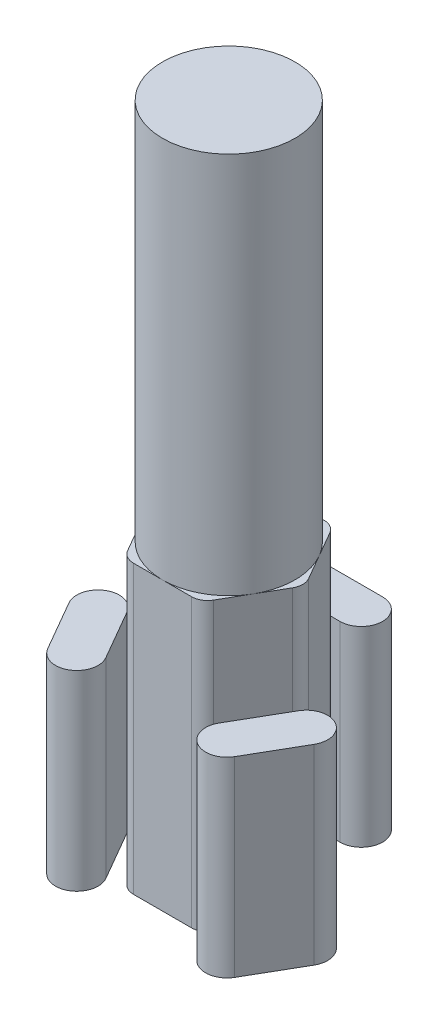
ISO-10303-21;
HEADER;
FILE_DESCRIPTION(('STEP AP214'),'2;1');
FILE_NAME('part.step','',(''),(''),'','','');
FILE_SCHEMA(('AUTOMOTIVE_DESIGN { 1 0 10303 214 1 1 1 1 }'));
ENDSEC;
DATA;
#1=APPLICATION_CONTEXT('core data for automotive mechanical design processes');
#2=APPLICATION_PROTOCOL_DEFINITION('international standard','automotive_design',2000,#1);
#3=PRODUCT_CONTEXT('',#1,'mechanical');
#4=PRODUCT('Part','Part','',(#3));
#5=PRODUCT_RELATED_PRODUCT_CATEGORY('part','',(#4));
#6=PRODUCT_DEFINITION_FORMATION('','',#4);
#7=PRODUCT_DEFINITION_CONTEXT('part definition',#1,'design');
#8=PRODUCT_DEFINITION('design','',#6,#7);
#9=PRODUCT_DEFINITION_SHAPE('','',#8);
#10=(LENGTH_UNIT() NAMED_UNIT(*) SI_UNIT(.MILLI.,.METRE.));
#11=(NAMED_UNIT(*) PLANE_ANGLE_UNIT() SI_UNIT($,.RADIAN.));
#12=(NAMED_UNIT(*) SI_UNIT($,.STERADIAN.) SOLID_ANGLE_UNIT());
#13=UNCERTAINTY_MEASURE_WITH_UNIT(LENGTH_MEASURE(1.E-05),#10,'distance_accuracy_value','');
#14=(GEOMETRIC_REPRESENTATION_CONTEXT(3) GLOBAL_UNCERTAINTY_ASSIGNED_CONTEXT((#13)) GLOBAL_UNIT_ASSIGNED_CONTEXT((#10,
#11,#12)) REPRESENTATION_CONTEXT('',''));
#15=CARTESIAN_POINT('',(0.,0.,0.));
#16=DIRECTION('',(0.,0.,1.));
#17=DIRECTION('',(1.,0.,0.));
#18=AXIS2_PLACEMENT_3D('',#15,#16,#17);
#19=CARTESIAN_POINT('',(-0.23558088659788,0.9,0.241243419565394));
#20=DIRECTION('',(0.,-1.,0.));
#21=DIRECTION('',(0.,0.,-1.));
#22=AXIS2_PLACEMENT_3D('',#19,#20,#21);
#23=CYLINDRICAL_SURFACE('',#22,0.066794645314256);
#24=DIRECTION('',(0.,-1.,0.));
#25=VECTOR('',#24,1.);
#26=CARTESIAN_POINT('',(-0.177735026918963,0.9,0.207846096908266));
#27=LINE('',#26,#25);
#28=CARTESIAN_POINT('',(-0.177735026918963,0.6,0.207846096908266));
#29=VERTEX_POINT('',#28);
#30=CARTESIAN_POINT('',(-0.177735026918963,0.,0.207846096908266));
#31=VERTEX_POINT('',#30);
#32=EDGE_CURVE('E12',#29,#31,#27,.T.);
#33=ORIENTED_EDGE('',*,*,#32,.F.);
#34=CARTESIAN_POINT('',(-0.23558088659788,0.6,0.241243419565394));
#35=DIRECTION('',(0.,1.,0.));
#36=DIRECTION('',(0.,0.,-1.));
#37=AXIS2_PLACEMENT_3D('',#34,#35,#36);
#38=CIRCLE('',#37,0.066794645314256);
#39=CARTESIAN_POINT('',(-0.293426746276797,0.6,0.274640742222522));
#40=VERTEX_POINT('',#39);
#41=EDGE_CURVE('E86',#40,#29,#38,.T.);
#42=ORIENTED_EDGE('',*,*,#41,.F.);
#43=DIRECTION('',(0.,-1.,0.));
#44=VECTOR('',#43,1.);
#45=CARTESIAN_POINT('',(-0.293426746276797,0.9,0.274640742222522));
#46=LINE('',#45,#44);
#47=CARTESIAN_POINT('',(-0.293426746276797,0.,0.274640742222522));
#48=VERTEX_POINT('',#47);
#49=EDGE_CURVE('E70',#40,#48,#46,.T.);
#50=ORIENTED_EDGE('',*,*,#49,.T.);
#51=CARTESIAN_POINT('',(-0.23558088659788,0.,0.241243419565394));
#52=DIRECTION('',(0.,1.,0.));
#53=DIRECTION('',(0.,0.,-1.));
#54=AXIS2_PLACEMENT_3D('',#51,#52,#53);
#55=CIRCLE('',#54,0.066794645314256);
#56=EDGE_CURVE('E100',#48,#31,#55,.T.);
#57=ORIENTED_EDGE('',*,*,#56,.T.);
#58=EDGE_LOOP('',(#33,#42,#50,#57));
#59=FACE_BOUND('',#58,.T.);
#60=ADVANCED_FACE('F48',(#59),#23,.T.);
#61=CARTESIAN_POINT('',(-0.268867513459482,0.9,0.0500000000000002));
#62=DIRECTION('',(-0.866025403784438,0.,0.500000000000001));
#63=DIRECTION('',(0.500000000000001,0.,0.866025403784438));
#64=AXIS2_PLACEMENT_3D('',#61,#62,#63);
#65=PLANE('',#64);
#66=DIRECTION('',(0.,-1.,0.));
#67=VECTOR('',#66,1.);
#68=CARTESIAN_POINT('',(-0.268867513459482,0.9,0.0500000000000002));
#69=LINE('',#68,#67);
#70=CARTESIAN_POINT('',(-0.268867513459482,0.6,0.0500000000000002));
#71=VERTEX_POINT('',#70);
#72=CARTESIAN_POINT('',(-0.268867513459482,0.,0.0500000000000002));
#73=VERTEX_POINT('',#72);
#74=EDGE_CURVE('E55',#71,#73,#69,.T.);
#75=ORIENTED_EDGE('',*,*,#74,.F.);
#76=DIRECTION('',(-0.500000000000001,0.,-0.866025403784438));
#77=VECTOR('',#76,1.);
#78=CARTESIAN_POINT('',(-0.177735026918963,0.6,0.207846096908266));
#79=LINE('',#78,#77);
#80=EDGE_CURVE('E89',#29,#71,#79,.T.);
#81=ORIENTED_EDGE('',*,*,#80,.F.);
#82=ORIENTED_EDGE('',*,*,#32,.T.);
#83=DIRECTION('',(-0.500000000000001,0.,-0.866025403784438));
#84=VECTOR('',#83,1.);
#85=CARTESIAN_POINT('',(-0.268867513459482,0.,0.0500000000000002));
#86=LINE('',#85,#84);
#87=EDGE_CURVE('E103',#31,#73,#86,.T.);
#88=ORIENTED_EDGE('',*,*,#87,.T.);
#89=EDGE_LOOP('',(#75,#81,#82,#88));
#90=FACE_BOUND('',#89,.T.);
#91=ADVANCED_FACE('F95',(#90),#65,.F.);
#92=CARTESIAN_POINT('',(-0.326713373138399,0.9,0.0833973226571282));
#93=DIRECTION('',(0.,-1.,0.));
#94=DIRECTION('',(0.,0.,-1.));
#95=AXIS2_PLACEMENT_3D('',#92,#93,#94);
#96=CYLINDRICAL_SURFACE('',#95,0.066794645314256);
#97=DIRECTION('',(0.,-1.,0.));
#98=VECTOR('',#97,1.);
#99=CARTESIAN_POINT('',(-0.384559232817316,0.9,0.116794645314256));
#100=LINE('',#99,#98);
#101=CARTESIAN_POINT('',(-0.384559232817316,0.6,0.116794645314256));
#102=VERTEX_POINT('',#101);
#103=CARTESIAN_POINT('',(-0.384559232817316,0.,0.116794645314256));
#104=VERTEX_POINT('',#103);
#105=EDGE_CURVE('E115',#102,#104,#100,.T.);
#106=ORIENTED_EDGE('',*,*,#105,.F.);
#107=CARTESIAN_POINT('',(-0.326713373138399,0.6,0.0833973226571282));
#108=DIRECTION('',(0.,1.,0.));
#109=DIRECTION('',(0.,0.,-1.));
#110=AXIS2_PLACEMENT_3D('',#107,#108,#109);
#111=CIRCLE('',#110,0.0667946453142561);
#112=EDGE_CURVE('E62',#71,#102,#111,.T.);
#113=ORIENTED_EDGE('',*,*,#112,.F.);
#114=ORIENTED_EDGE('',*,*,#74,.T.);
#115=CARTESIAN_POINT('',(-0.326713373138399,0.,0.0833973226571282));
#116=DIRECTION('',(0.,1.,0.));
#117=DIRECTION('',(0.,0.,1.));
#118=AXIS2_PLACEMENT_3D('',#115,#116,#117);
#119=CIRCLE('',#118,0.066794645314256);
#120=EDGE_CURVE('E105',#73,#104,#119,.T.);
#121=ORIENTED_EDGE('',*,*,#120,.T.);
#122=EDGE_LOOP('',(#106,#113,#114,#121));
#123=FACE_BOUND('',#122,.T.);
#124=ADVANCED_FACE('F118',(#123),#96,.T.);
#125=CARTESIAN_POINT('',(-0.384559232817316,0.9,0.116794645314256));
#126=DIRECTION('',(0.866025403784438,0.,-0.500000000000001));
#127=DIRECTION('',(-0.500000000000001,0.,-0.866025403784438));
#128=AXIS2_PLACEMENT_3D('',#125,#126,#127);
#129=PLANE('',#128);
#130=ORIENTED_EDGE('',*,*,#49,.F.);
#131=DIRECTION('',(0.500000000000001,0.,0.866025403784438));
#132=VECTOR('',#131,1.);
#133=CARTESIAN_POINT('',(-0.293426746276797,0.6,0.274640742222522));
#134=LINE('',#133,#132);
#135=EDGE_CURVE('E90',#102,#40,#134,.T.);
#136=ORIENTED_EDGE('',*,*,#135,.F.);
#137=ORIENTED_EDGE('',*,*,#105,.T.);
#138=DIRECTION('',(0.500000000000001,0.,0.866025403784438));
#139=VECTOR('',#138,1.);
#140=CARTESIAN_POINT('',(-0.384559232817316,0.,0.116794645314256));
#141=LINE('',#140,#139);
#142=EDGE_CURVE('E112',#104,#48,#141,.T.);
#143=ORIENTED_EDGE('',*,*,#142,.T.);
#144=EDGE_LOOP('',(#130,#136,#137,#143));
#145=FACE_BOUND('',#144,.T.);
#146=ADVANCED_FACE('F122',(#145),#129,.F.);
#147=CARTESIAN_POINT('',(-0.23558088659788,0.,0.241243419565394));
#148=DIRECTION('',(0.,-1.,0.));
#149=DIRECTION('',(0.,0.,-1.));
#150=AXIS2_PLACEMENT_3D('',#147,#148,#149);
#151=PLANE('',#150);
#152=ORIENTED_EDGE('',*,*,#56,.F.);
#153=ORIENTED_EDGE('',*,*,#142,.F.);
#154=ORIENTED_EDGE('',*,*,#120,.F.);
#155=ORIENTED_EDGE('',*,*,#87,.F.);
#156=EDGE_LOOP('',(#152,#153,#154,#155));
#157=FACE_BOUND('',#156,.T.);
#158=ADVANCED_FACE('F120',(#157),#151,.T.);
#159=CARTESIAN_POINT('',(-0.23558088659788,0.6,0.241243419565394));
#160=DIRECTION('',(0.,-1.,0.));
#161=DIRECTION('',(0.,0.,-1.));
#162=AXIS2_PLACEMENT_3D('',#159,#160,#161);
#163=PLANE('',#162);
#164=ORIENTED_EDGE('',*,*,#41,.T.);
#165=ORIENTED_EDGE('',*,*,#80,.T.);
#166=ORIENTED_EDGE('',*,*,#112,.T.);
#167=ORIENTED_EDGE('',*,*,#135,.T.);
#168=EDGE_LOOP('',(#164,#165,#166,#167));
#169=FACE_BOUND('',#168,.T.);
#170=ADVANCED_FACE('F88',(#169),#163,.F.);
#171=CLOSED_SHELL('',(#60,#91,#124,#146,#158,#170));
#172=MANIFOLD_SOLID_BREP('B2',#171);
#173=CARTESIAN_POINT('',(0.326713373138399,0.9,0.083397322657128));
#174=DIRECTION('',(0.,-1.,0.));
#175=DIRECTION('',(0.,0.,-1.));
#176=AXIS2_PLACEMENT_3D('',#173,#174,#175);
#177=CYLINDRICAL_SURFACE('',#176,0.066794645314256);
#178=DIRECTION('',(0.,-1.,0.));
#179=VECTOR('',#178,1.);
#180=CARTESIAN_POINT('',(0.268867513459482,0.9,0.05));
#181=LINE('',#180,#179);
#182=CARTESIAN_POINT('',(0.268867513459482,0.6,0.05));
#183=VERTEX_POINT('',#182);
#184=CARTESIAN_POINT('',(0.268867513459482,0.,0.05));
#185=VERTEX_POINT('',#184);
#186=EDGE_CURVE('E46',#183,#185,#181,.T.);
#187=ORIENTED_EDGE('',*,*,#186,.F.);
#188=CARTESIAN_POINT('',(0.326713373138399,0.6,0.083397322657128));
#189=DIRECTION('',(0.,1.,0.));
#190=DIRECTION('',(0.,0.,-1.));
#191=AXIS2_PLACEMENT_3D('',#188,#189,#190);
#192=CIRCLE('',#191,0.066794645314256);
#193=CARTESIAN_POINT('',(0.384559232817316,0.6,0.116794645314256));
#194=VERTEX_POINT('',#193);
#195=EDGE_CURVE('E220',#194,#183,#192,.T.);
#196=ORIENTED_EDGE('',*,*,#195,.F.);
#197=DIRECTION('',(0.,-1.,0.));
#198=VECTOR('',#197,1.);
#199=CARTESIAN_POINT('',(0.384559232817316,0.9,0.116794645314256));
#200=LINE('',#199,#198);
#201=CARTESIAN_POINT('',(0.384559232817316,0.,0.116794645314256));
#202=VERTEX_POINT('',#201);
#203=EDGE_CURVE('E204',#194,#202,#200,.T.);
#204=ORIENTED_EDGE('',*,*,#203,.T.);
#205=CARTESIAN_POINT('',(0.326713373138399,0.,0.083397322657128));
#206=DIRECTION('',(0.,1.,0.));
#207=DIRECTION('',(0.,0.,-1.));
#208=AXIS2_PLACEMENT_3D('',#205,#206,#207);
#209=CIRCLE('',#208,0.066794645314256);
#210=EDGE_CURVE('E234',#202,#185,#209,.T.);
#211=ORIENTED_EDGE('',*,*,#210,.T.);
#212=EDGE_LOOP('',(#187,#196,#204,#211));
#213=FACE_BOUND('',#212,.T.);
#214=ADVANCED_FACE('F182',(#213),#177,.T.);
#215=CARTESIAN_POINT('',(0.177735026918963,0.9,0.207846096908266));
#216=DIRECTION('',(0.866025403784439,0.,0.5));
#217=DIRECTION('',(0.5,0.,-0.866025403784439));
#218=AXIS2_PLACEMENT_3D('',#215,#216,#217);
#219=PLANE('',#218);
#220=DIRECTION('',(0.,-1.,0.));
#221=VECTOR('',#220,1.);
#222=CARTESIAN_POINT('',(0.177735026918963,0.9,0.207846096908266));
#223=LINE('',#222,#221);
#224=CARTESIAN_POINT('',(0.177735026918963,0.6,0.207846096908266));
#225=VERTEX_POINT('',#224);
#226=CARTESIAN_POINT('',(0.177735026918963,0.,0.207846096908266));
#227=VERTEX_POINT('',#226);
#228=EDGE_CURVE('E189',#225,#227,#223,.T.);
#229=ORIENTED_EDGE('',*,*,#228,.F.);
#230=DIRECTION('',(-0.5,0.,0.866025403784439));
#231=VECTOR('',#230,1.);
#232=CARTESIAN_POINT('',(0.268867513459482,0.6,0.05));
#233=LINE('',#232,#231);
#234=EDGE_CURVE('E223',#183,#225,#233,.T.);
#235=ORIENTED_EDGE('',*,*,#234,.F.);
#236=ORIENTED_EDGE('',*,*,#186,.T.);
#237=DIRECTION('',(-0.5,0.,0.866025403784439));
#238=VECTOR('',#237,1.);
#239=CARTESIAN_POINT('',(0.177735026918963,0.,0.207846096908266));
#240=LINE('',#239,#238);
#241=EDGE_CURVE('E237',#185,#227,#240,.T.);
#242=ORIENTED_EDGE('',*,*,#241,.T.);
#243=EDGE_LOOP('',(#229,#235,#236,#242));
#244=FACE_BOUND('',#243,.T.);
#245=ADVANCED_FACE('F229',(#244),#219,.F.);
#246=CARTESIAN_POINT('',(0.23558088659788,0.9,0.241243419565394));
#247=DIRECTION('',(0.,-1.,0.));
#248=DIRECTION('',(0.,0.,-1.));
#249=AXIS2_PLACEMENT_3D('',#246,#247,#248);
#250=CYLINDRICAL_SURFACE('',#249,0.066794645314256);
#251=DIRECTION('',(0.,-1.,0.));
#252=VECTOR('',#251,1.);
#253=CARTESIAN_POINT('',(0.293426746276797,0.9,0.274640742222522));
#254=LINE('',#253,#252);
#255=CARTESIAN_POINT('',(0.293426746276797,0.6,0.274640742222522));
#256=VERTEX_POINT('',#255);
#257=CARTESIAN_POINT('',(0.293426746276797,0.,0.274640742222522));
#258=VERTEX_POINT('',#257);
#259=EDGE_CURVE('E249',#256,#258,#254,.T.);
#260=ORIENTED_EDGE('',*,*,#259,.F.);
#261=CARTESIAN_POINT('',(0.23558088659788,0.6,0.241243419565394));
#262=DIRECTION('',(0.,1.,0.));
#263=DIRECTION('',(0.,0.,-1.));
#264=AXIS2_PLACEMENT_3D('',#261,#262,#263);
#265=CIRCLE('',#264,0.066794645314256);
#266=EDGE_CURVE('E196',#225,#256,#265,.T.);
#267=ORIENTED_EDGE('',*,*,#266,.F.);
#268=ORIENTED_EDGE('',*,*,#228,.T.);
#269=CARTESIAN_POINT('',(0.23558088659788,0.,0.241243419565394));
#270=DIRECTION('',(0.,1.,0.));
#271=DIRECTION('',(0.,0.,1.));
#272=AXIS2_PLACEMENT_3D('',#269,#270,#271);
#273=CIRCLE('',#272,0.066794645314256);
#274=EDGE_CURVE('E239',#227,#258,#273,.T.);
#275=ORIENTED_EDGE('',*,*,#274,.T.);
#276=EDGE_LOOP('',(#260,#267,#268,#275));
#277=FACE_BOUND('',#276,.T.);
#278=ADVANCED_FACE('F252',(#277),#250,.T.);
#279=CARTESIAN_POINT('',(0.293426746276797,0.9,0.274640742222522));
#280=DIRECTION('',(-0.866025403784439,0.,-0.5));
#281=DIRECTION('',(-0.5,0.,0.866025403784439));
#282=AXIS2_PLACEMENT_3D('',#279,#280,#281);
#283=PLANE('',#282);
#284=ORIENTED_EDGE('',*,*,#203,.F.);
#285=DIRECTION('',(0.5,0.,-0.866025403784439));
#286=VECTOR('',#285,1.);
#287=CARTESIAN_POINT('',(0.384559232817316,0.6,0.116794645314256));
#288=LINE('',#287,#286);
#289=EDGE_CURVE('E224',#256,#194,#288,.T.);
#290=ORIENTED_EDGE('',*,*,#289,.F.);
#291=ORIENTED_EDGE('',*,*,#259,.T.);
#292=DIRECTION('',(0.5,0.,-0.866025403784439));
#293=VECTOR('',#292,1.);
#294=CARTESIAN_POINT('',(0.293426746276797,0.,0.274640742222522));
#295=LINE('',#294,#293);
#296=EDGE_CURVE('E246',#258,#202,#295,.T.);
#297=ORIENTED_EDGE('',*,*,#296,.T.);
#298=EDGE_LOOP('',(#284,#290,#291,#297));
#299=FACE_BOUND('',#298,.T.);
#300=ADVANCED_FACE('F256',(#299),#283,.F.);
#301=CARTESIAN_POINT('',(0.326713373138399,0.,0.083397322657128));
#302=DIRECTION('',(0.,-1.,0.));
#303=DIRECTION('',(0.,0.,-1.));
#304=AXIS2_PLACEMENT_3D('',#301,#302,#303);
#305=PLANE('',#304);
#306=ORIENTED_EDGE('',*,*,#210,.F.);
#307=ORIENTED_EDGE('',*,*,#296,.F.);
#308=ORIENTED_EDGE('',*,*,#274,.F.);
#309=ORIENTED_EDGE('',*,*,#241,.F.);
#310=EDGE_LOOP('',(#306,#307,#308,#309));
#311=FACE_BOUND('',#310,.T.);
#312=ADVANCED_FACE('F254',(#311),#305,.T.);
#313=CARTESIAN_POINT('',(0.326713373138399,0.6,0.083397322657128));
#314=DIRECTION('',(0.,-1.,0.));
#315=DIRECTION('',(0.,0.,-1.));
#316=AXIS2_PLACEMENT_3D('',#313,#314,#315);
#317=PLANE('',#316);
#318=ORIENTED_EDGE('',*,*,#195,.T.);
#319=ORIENTED_EDGE('',*,*,#234,.T.);
#320=ORIENTED_EDGE('',*,*,#266,.T.);
#321=ORIENTED_EDGE('',*,*,#289,.T.);
#322=EDGE_LOOP('',(#318,#319,#320,#321));
#323=FACE_BOUND('',#322,.T.);
#324=ADVANCED_FACE('F222',(#323),#317,.F.);
#325=CLOSED_SHELL('',(#214,#245,#278,#300,#312,#324));
#326=MANIFOLD_SOLID_BREP('B6',#325);
#327=CARTESIAN_POINT('',(-0.0911324865405191,0.9,-0.324640742222522));
#328=DIRECTION('',(0.,-1.,0.));
#329=DIRECTION('',(0.,0.,-1.));
#330=AXIS2_PLACEMENT_3D('',#327,#328,#329);
#331=CYLINDRICAL_SURFACE('',#330,0.066794645314256);
#332=CARTESIAN_POINT('',(-0.0911324865405192,0.6,-0.324640742222522));
#333=DIRECTION('',(0.,1.,0.));
#334=DIRECTION('',(0.,0.,1.));
#335=AXIS2_PLACEMENT_3D('',#332,#333,#334);
#336=CIRCLE('',#335,0.066794645314256);
#337=CARTESIAN_POINT('',(-0.0911324865405193,0.6,-0.391435387536778));
#338=VERTEX_POINT('',#337);
#339=CARTESIAN_POINT('',(-0.0911324865405191,0.6,-0.257846096908266));
#340=VERTEX_POINT('',#339);
#341=EDGE_CURVE('E353',#338,#340,#336,.T.);
#342=ORIENTED_EDGE('',*,*,#341,.F.);
#343=DIRECTION('',(0.,-1.,0.));
#344=VECTOR('',#343,1.);
#345=CARTESIAN_POINT('',(-0.0911324865405191,0.9,-0.391435387536778));
#346=LINE('',#345,#344);
#347=CARTESIAN_POINT('',(-0.0911324865405191,0.,-0.391435387536778));
#348=VERTEX_POINT('',#347);
#349=EDGE_CURVE('E337',#338,#348,#346,.T.);
#350=ORIENTED_EDGE('',*,*,#349,.T.);
#351=CARTESIAN_POINT('',(-0.0911324865405191,0.,-0.324640742222522));
#352=DIRECTION('',(0.,1.,0.));
#353=DIRECTION('',(0.,0.,-1.));
#354=AXIS2_PLACEMENT_3D('',#351,#352,#353);
#355=CIRCLE('',#354,0.066794645314256);
#356=CARTESIAN_POINT('',(-0.0911324865405191,0.,-0.257846096908266));
#357=VERTEX_POINT('',#356);
#358=EDGE_CURVE('E367',#348,#357,#355,.T.);
#359=ORIENTED_EDGE('',*,*,#358,.T.);
#360=DIRECTION('',(0.,-1.,0.));
#361=VECTOR('',#360,1.);
#362=CARTESIAN_POINT('',(-0.0911324865405191,0.9,-0.257846096908266));
#363=LINE('',#362,#361);
#364=EDGE_CURVE('E180',#340,#357,#363,.T.);
#365=ORIENTED_EDGE('',*,*,#364,.F.);
#366=EDGE_LOOP('',(#342,#350,#359,#365));
#367=FACE_BOUND('',#366,.T.);
#368=ADVANCED_FACE('F315',(#367),#331,.T.);
#369=CARTESIAN_POINT('',(-0.0911324865405191,0.9,-0.257846096908266));
#370=DIRECTION('',(0.,0.,-1.));
#371=DIRECTION('',(-1.,0.,0.));
#372=AXIS2_PLACEMENT_3D('',#369,#370,#371);
#373=PLANE('',#372);
#374=DIRECTION('',(1.,0.,0.));
#375=VECTOR('',#374,1.);
#376=CARTESIAN_POINT('',(0.0911324865405191,0.6,-0.257846096908266));
#377=LINE('',#376,#375);
#378=CARTESIAN_POINT('',(0.0911324865405191,0.6,-0.257846096908266));
#379=VERTEX_POINT('',#378);
#380=EDGE_CURVE('E356',#340,#379,#377,.T.);
#381=ORIENTED_EDGE('',*,*,#380,.F.);
#382=ORIENTED_EDGE('',*,*,#364,.T.);
#383=DIRECTION('',(1.,0.,0.));
#384=VECTOR('',#383,1.);
#385=CARTESIAN_POINT('',(-0.0911324865405191,0.,-0.257846096908266));
#386=LINE('',#385,#384);
#387=CARTESIAN_POINT('',(0.0911324865405191,0.,-0.257846096908266));
#388=VERTEX_POINT('',#387);
#389=EDGE_CURVE('E370',#357,#388,#386,.T.);
#390=ORIENTED_EDGE('',*,*,#389,.T.);
#391=DIRECTION('',(0.,-1.,0.));
#392=VECTOR('',#391,1.);
#393=CARTESIAN_POINT('',(0.0911324865405191,0.9,-0.257846096908266));
#394=LINE('',#393,#392);
#395=EDGE_CURVE('E322',#379,#388,#394,.T.);
#396=ORIENTED_EDGE('',*,*,#395,.F.);
#397=EDGE_LOOP('',(#381,#382,#390,#396));
#398=FACE_BOUND('',#397,.T.);
#399=ADVANCED_FACE('F362',(#398),#373,.F.);
#400=CARTESIAN_POINT('',(0.0911324865405191,0.9,-0.324640742222522));
#401=DIRECTION('',(0.,-1.,0.));
#402=DIRECTION('',(0.,0.,-1.));
#403=AXIS2_PLACEMENT_3D('',#400,#401,#402);
#404=CYLINDRICAL_SURFACE('',#403,0.066794645314256);
#405=CARTESIAN_POINT('',(0.0911324865405189,0.6,-0.324640742222522));
#406=DIRECTION('',(0.,1.,0.));
#407=DIRECTION('',(0.,0.,1.));
#408=AXIS2_PLACEMENT_3D('',#405,#406,#407);
#409=CIRCLE('',#408,0.066794645314256);
#410=CARTESIAN_POINT('',(0.0911324865405191,0.6,-0.391435387536778));
#411=VERTEX_POINT('',#410);
#412=EDGE_CURVE('E329',#379,#411,#409,.T.);
#413=ORIENTED_EDGE('',*,*,#412,.F.);
#414=ORIENTED_EDGE('',*,*,#395,.T.);
#415=CARTESIAN_POINT('',(0.0911324865405191,0.,-0.324640742222522));
#416=DIRECTION('',(0.,1.,0.));
#417=DIRECTION('',(0.,0.,1.));
#418=AXIS2_PLACEMENT_3D('',#415,#416,#417);
#419=CIRCLE('',#418,0.066794645314256);
#420=CARTESIAN_POINT('',(0.0911324865405191,0.,-0.391435387536778));
#421=VERTEX_POINT('',#420);
#422=EDGE_CURVE('E372',#388,#421,#419,.T.);
#423=ORIENTED_EDGE('',*,*,#422,.T.);
#424=DIRECTION('',(0.,-1.,0.));
#425=VECTOR('',#424,1.);
#426=CARTESIAN_POINT('',(0.0911324865405191,0.9,-0.391435387536778));
#427=LINE('',#426,#425);
#428=EDGE_CURVE('E382',#411,#421,#427,.T.);
#429=ORIENTED_EDGE('',*,*,#428,.F.);
#430=EDGE_LOOP('',(#413,#414,#423,#429));
#431=FACE_BOUND('',#430,.T.);
#432=ADVANCED_FACE('F384',(#431),#404,.T.);
#433=CARTESIAN_POINT('',(-0.0911324865405191,0.9,-0.391435387536778));
#434=DIRECTION('',(0.,0.,1.));
#435=DIRECTION('',(1.,0.,0.));
#436=AXIS2_PLACEMENT_3D('',#433,#434,#435);
#437=PLANE('',#436);
#438=DIRECTION('',(-1.,0.,0.));
#439=VECTOR('',#438,1.);
#440=CARTESIAN_POINT('',(-0.0911324865405193,0.6,-0.391435387536778));
#441=LINE('',#440,#439);
#442=EDGE_CURVE('E357',#411,#338,#441,.T.);
#443=ORIENTED_EDGE('',*,*,#442,.F.);
#444=ORIENTED_EDGE('',*,*,#428,.T.);
#445=DIRECTION('',(-1.,0.,0.));
#446=VECTOR('',#445,1.);
#447=CARTESIAN_POINT('',(-0.0911324865405191,0.,-0.391435387536778));
#448=LINE('',#447,#446);
#449=EDGE_CURVE('E379',#421,#348,#448,.T.);
#450=ORIENTED_EDGE('',*,*,#449,.T.);
#451=ORIENTED_EDGE('',*,*,#349,.F.);
#452=EDGE_LOOP('',(#443,#444,#450,#451));
#453=FACE_BOUND('',#452,.T.);
#454=ADVANCED_FACE('F389',(#453),#437,.F.);
#455=CARTESIAN_POINT('',(-0.0911324865405191,0.,-0.324640742222522));
#456=DIRECTION('',(0.,-1.,0.));
#457=DIRECTION('',(0.,0.,-1.));
#458=AXIS2_PLACEMENT_3D('',#455,#456,#457);
#459=PLANE('',#458);
#460=ORIENTED_EDGE('',*,*,#358,.F.);
#461=ORIENTED_EDGE('',*,*,#449,.F.);
#462=ORIENTED_EDGE('',*,*,#422,.F.);
#463=ORIENTED_EDGE('',*,*,#389,.F.);
#464=EDGE_LOOP('',(#460,#461,#462,#463));
#465=FACE_BOUND('',#464,.T.);
#466=ADVANCED_FACE('F387',(#465),#459,.T.);
#467=CARTESIAN_POINT('',(-0.0911324865405192,0.6,-0.324640742222522));
#468=DIRECTION('',(0.,1.,0.));
#469=DIRECTION('',(0.,0.,1.));
#470=AXIS2_PLACEMENT_3D('',#467,#468,#469);
#471=PLANE('',#470);
#472=ORIENTED_EDGE('',*,*,#341,.T.);
#473=ORIENTED_EDGE('',*,*,#380,.T.);
#474=ORIENTED_EDGE('',*,*,#412,.T.);
#475=ORIENTED_EDGE('',*,*,#442,.T.);
#476=EDGE_LOOP('',(#472,#473,#474,#475));
#477=FACE_BOUND('',#476,.T.);
#478=ADVANCED_FACE('F355',(#477),#471,.T.);
#479=CLOSED_SHELL('',(#368,#399,#432,#454,#466,#478));
#480=MANIFOLD_SOLID_BREP('B40',#479);
#481=CARTESIAN_POINT('',(-0.0911324865405191,0.9,-0.157846096908266));
#482=DIRECTION('',(0.,-1.,0.));
#483=DIRECTION('',(0.,0.,-1.));
#484=AXIS2_PLACEMENT_3D('',#481,#482,#483);
#485=PLANE('',#484);
#486=CARTESIAN_POINT('',(0.,0.9,0.));
#487=DIRECTION('',(0.,1.,0.));
#488=DIRECTION('',(0.,0.,1.));
#489=AXIS2_PLACEMENT_3D('',#486,#487,#488);
#490=CIRCLE('',#489,0.207846096908266);
#491=CARTESIAN_POINT('',(0.,0.9,0.207846096908266));
#492=VERTEX_POINT('',#491);
#493=CARTESIAN_POINT('',(0.180000000000001,0.9,0.103923048454133));
#494=VERTEX_POINT('',#493);
#495=EDGE_CURVE('E450',#492,#494,#490,.T.);
#496=ORIENTED_EDGE('',*,*,#495,.F.);
#497=DIRECTION('',(1.,0.,0.));
#498=VECTOR('',#497,1.);
#499=CARTESIAN_POINT('',(-0.091132486540519,0.9,0.207846096908266));
#500=LINE('',#499,#498);
#501=CARTESIAN_POINT('',(0.0911324865405191,0.9,0.207846096908266));
#502=VERTEX_POINT('',#501);
#503=EDGE_CURVE('E561',#492,#502,#500,.T.);
#504=ORIENTED_EDGE('',*,*,#503,.T.);
#505=CARTESIAN_POINT('',(0.0911324865405191,0.9,0.157846096908266));
#506=DIRECTION('',(0.,1.,0.));
#507=DIRECTION('',(0.,0.,1.));
#508=AXIS2_PLACEMENT_3D('',#505,#506,#507);
#509=CIRCLE('',#508,0.05);
#510=CARTESIAN_POINT('',(0.134433756729741,0.9,0.182846096908266));
#511=VERTEX_POINT('',#510);
#512=EDGE_CURVE('E560',#502,#511,#509,.T.);
#513=ORIENTED_EDGE('',*,*,#512,.T.);
#514=DIRECTION('',(0.5,0.,-0.866025403784438));
#515=VECTOR('',#514,1.);
#516=CARTESIAN_POINT('',(0.134433756729741,0.9,0.182846096908266));
#517=LINE('',#516,#515);
#518=EDGE_CURVE('E573',#511,#494,#517,.T.);
#519=ORIENTED_EDGE('',*,*,#518,.T.);
#520=EDGE_LOOP('',(#496,#504,#513,#519));
#521=FACE_BOUND('',#520,.T.);
#522=ADVANCED_FACE('F439',(#521),#485,.F.);
#523=CARTESIAN_POINT('',(0.180000000000001,0.9,-0.103923048454133));
#524=VERTEX_POINT('',#523);
#525=EDGE_CURVE('E313',#494,#524,#490,.T.);
#526=ORIENTED_EDGE('',*,*,#525,.F.);
#527=CARTESIAN_POINT('',(0.22556624327026,0.9,0.0250000000000001));
#528=VERTEX_POINT('',#527);
#529=EDGE_CURVE('E598',#494,#528,#517,.T.);
#530=ORIENTED_EDGE('',*,*,#529,.T.);
#531=CARTESIAN_POINT('',(0.182264973081038,0.9,0.));
#532=DIRECTION('',(0.,1.,0.));
#533=DIRECTION('',(0.,0.,1.));
#534=AXIS2_PLACEMENT_3D('',#531,#532,#533);
#535=CIRCLE('',#534,0.05);
#536=CARTESIAN_POINT('',(0.22556624327026,0.9,-0.0249999999999999));
#537=VERTEX_POINT('',#536);
#538=EDGE_CURVE('E600',#528,#537,#535,.T.);
#539=ORIENTED_EDGE('',*,*,#538,.T.);
#540=DIRECTION('',(-0.5,0.,-0.866025403784439));
#541=VECTOR('',#540,1.);
#542=CARTESIAN_POINT('',(0.22556624327026,0.9,-0.0249999999999999));
#543=LINE('',#542,#541);
#544=EDGE_CURVE('E603',#537,#524,#543,.T.);
#545=ORIENTED_EDGE('',*,*,#544,.T.);
#546=EDGE_LOOP('',(#526,#530,#539,#545));
#547=FACE_BOUND('',#546,.T.);
#548=ADVANCED_FACE('F694',(#547),#485,.F.);
#549=CARTESIAN_POINT('',(0.,0.9,-0.207846096908266));
#550=VERTEX_POINT('',#549);
#551=EDGE_CURVE('E448',#524,#550,#490,.T.);
#552=ORIENTED_EDGE('',*,*,#551,.F.);
#553=CARTESIAN_POINT('',(0.134433756729741,0.9,-0.182846096908266));
#554=VERTEX_POINT('',#553);
#555=EDGE_CURVE('E602',#524,#554,#543,.T.);
#556=ORIENTED_EDGE('',*,*,#555,.T.);
#557=CARTESIAN_POINT('',(0.0911324865405191,0.9,-0.157846096908266));
#558=DIRECTION('',(0.,1.,0.));
#559=DIRECTION('',(0.,0.,1.));
#560=AXIS2_PLACEMENT_3D('',#557,#558,#559);
#561=CIRCLE('',#560,0.05);
#562=CARTESIAN_POINT('',(0.0911324865405191,0.9,-0.207846096908266));
#563=VERTEX_POINT('',#562);
#564=EDGE_CURVE('E606',#554,#563,#561,.T.);
#565=ORIENTED_EDGE('',*,*,#564,.T.);
#566=DIRECTION('',(-1.,0.,0.));
#567=VECTOR('',#566,1.);
#568=CARTESIAN_POINT('',(0.0911324865405191,0.9,-0.207846096908266));
#569=LINE('',#568,#567);
#570=EDGE_CURVE('E609',#563,#550,#569,.T.);
#571=ORIENTED_EDGE('',*,*,#570,.T.);
#572=EDGE_LOOP('',(#552,#556,#565,#571));
#573=FACE_BOUND('',#572,.T.);
#574=ADVANCED_FACE('F702',(#573),#485,.F.);
#575=CARTESIAN_POINT('',(-0.18,0.9,-0.103923048454133));
#576=VERTEX_POINT('',#575);
#577=EDGE_CURVE('E457',#550,#576,#490,.T.);
#578=ORIENTED_EDGE('',*,*,#577,.F.);
#579=CARTESIAN_POINT('',(-0.0911324865405191,0.9,-0.207846096908266));
#580=VERTEX_POINT('',#579);
#581=EDGE_CURVE('E608',#550,#580,#569,.T.);
#582=ORIENTED_EDGE('',*,*,#581,.T.);
#583=CARTESIAN_POINT('',(-0.0911324865405191,0.9,-0.157846096908266));
#584=DIRECTION('',(0.,1.,0.));
#585=DIRECTION('',(0.,0.,-1.));
#586=AXIS2_PLACEMENT_3D('',#583,#584,#585);
#587=CIRCLE('',#586,0.05);
#588=CARTESIAN_POINT('',(-0.134433756729741,0.9,-0.182846096908266));
#589=VERTEX_POINT('',#588);
#590=EDGE_CURVE('E583',#580,#589,#587,.T.);
#591=ORIENTED_EDGE('',*,*,#590,.T.);
#592=DIRECTION('',(-0.5,0.,0.866025403784439));
#593=VECTOR('',#592,1.);
#594=CARTESIAN_POINT('',(-0.134433756729741,0.9,-0.182846096908266));
#595=LINE('',#594,#593);
#596=EDGE_CURVE('E588',#589,#576,#595,.T.);
#597=ORIENTED_EDGE('',*,*,#596,.T.);
#598=EDGE_LOOP('',(#578,#582,#591,#597));
#599=FACE_BOUND('',#598,.T.);
#600=ADVANCED_FACE('F713',(#599),#485,.F.);
#601=CARTESIAN_POINT('',(-0.180000000000001,0.9,0.103923048454133));
#602=VERTEX_POINT('',#601);
#603=EDGE_CURVE('E578',#576,#602,#490,.T.);
#604=ORIENTED_EDGE('',*,*,#603,.F.);
#605=CARTESIAN_POINT('',(-0.22556624327026,0.9,-0.025));
#606=VERTEX_POINT('',#605);
#607=EDGE_CURVE('E586',#576,#606,#595,.T.);
#608=ORIENTED_EDGE('',*,*,#607,.T.);
#609=CARTESIAN_POINT('',(-0.182264973081038,0.9,0.));
#610=DIRECTION('',(0.,1.,0.));
#611=DIRECTION('',(0.,0.,-1.));
#612=AXIS2_PLACEMENT_3D('',#609,#610,#611);
#613=CIRCLE('',#612,0.05);
#614=CARTESIAN_POINT('',(-0.22556624327026,0.9,0.025));
#615=VERTEX_POINT('',#614);
#616=EDGE_CURVE('E590',#606,#615,#613,.T.);
#617=ORIENTED_EDGE('',*,*,#616,.T.);
#618=DIRECTION('',(0.5,0.,0.866025403784439));
#619=VECTOR('',#618,1.);
#620=CARTESIAN_POINT('',(-0.22556624327026,0.9,0.025));
#621=LINE('',#620,#619);
#622=EDGE_CURVE('E593',#615,#602,#621,.T.);
#623=ORIENTED_EDGE('',*,*,#622,.T.);
#624=EDGE_LOOP('',(#604,#608,#617,#623));
#625=FACE_BOUND('',#624,.T.);
#626=ADVANCED_FACE('F718',(#625),#485,.F.);
#627=CARTESIAN_POINT('',(-0.0911324865405191,0.9,-0.157846096908266));
#628=DIRECTION('',(0.,-1.,0.));
#629=DIRECTION('',(0.,0.,-1.));
#630=AXIS2_PLACEMENT_3D('',#627,#628,#629);
#631=CYLINDRICAL_SURFACE('',#630,0.05);
#632=CARTESIAN_POINT('',(-0.0911324865405191,0.,-0.157846096908266));
#633=DIRECTION('',(0.,1.,0.));
#634=DIRECTION('',(0.,0.,-1.));
#635=AXIS2_PLACEMENT_3D('',#632,#633,#634);
#636=CIRCLE('',#635,0.05);
#637=CARTESIAN_POINT('',(-0.0911324865405191,0.,-0.207846096908266));
#638=VERTEX_POINT('',#637);
#639=CARTESIAN_POINT('',(-0.134433756729741,0.,-0.182846096908266));
#640=VERTEX_POINT('',#639);
#641=EDGE_CURVE('E612',#638,#640,#636,.T.);
#642=ORIENTED_EDGE('',*,*,#641,.T.);
#643=DIRECTION('',(0.,-1.,0.));
#644=VECTOR('',#643,1.);
#645=CARTESIAN_POINT('',(-0.134433756729741,0.9,-0.182846096908266));
#646=LINE('',#645,#644);
#647=EDGE_CURVE('E443',#589,#640,#646,.T.);
#648=ORIENTED_EDGE('',*,*,#647,.F.);
#649=ORIENTED_EDGE('',*,*,#590,.F.);
#650=DIRECTION('',(0.,-1.,0.));
#651=VECTOR('',#650,1.);
#652=CARTESIAN_POINT('',(-0.0911324865405191,0.9,-0.207846096908266));
#653=LINE('',#652,#651);
#654=EDGE_CURVE('E611',#580,#638,#653,.T.);
#655=ORIENTED_EDGE('',*,*,#654,.T.);
#656=EDGE_LOOP('',(#642,#648,#649,#655));
#657=FACE_BOUND('',#656,.T.);
#658=ADVANCED_FACE('F441',(#657),#631,.T.);
#659=CARTESIAN_POINT('',(-0.134433756729741,0.9,-0.182846096908266));
#660=DIRECTION('',(0.866025403784439,0.,0.5));
#661=DIRECTION('',(0.5,0.,-0.866025403784439));
#662=AXIS2_PLACEMENT_3D('',#659,#660,#661);
#663=PLANE('',#662);
#664=DIRECTION('',(-0.5,0.,0.866025403784439));
#665=VECTOR('',#664,1.);
#666=CARTESIAN_POINT('',(-0.134433756729741,0.,-0.182846096908266));
#667=LINE('',#666,#665);
#668=CARTESIAN_POINT('',(-0.22556624327026,0.,-0.025));
#669=VERTEX_POINT('',#668);
#670=EDGE_CURVE('E615',#640,#669,#667,.T.);
#671=ORIENTED_EDGE('',*,*,#670,.T.);
#672=DIRECTION('',(0.,-1.,0.));
#673=VECTOR('',#672,1.);
#674=CARTESIAN_POINT('',(-0.22556624327026,0.9,-0.025));
#675=LINE('',#674,#673);
#676=EDGE_CURVE('E580',#606,#669,#675,.T.);
#677=ORIENTED_EDGE('',*,*,#676,.F.);
#678=ORIENTED_EDGE('',*,*,#607,.F.);
#679=ORIENTED_EDGE('',*,*,#596,.F.);
#680=ORIENTED_EDGE('',*,*,#647,.T.);
#681=EDGE_LOOP('',(#671,#677,#678,#679,#680));
#682=FACE_BOUND('',#681,.T.);
#683=ADVANCED_FACE('F716',(#682),#663,.F.);
#684=CARTESIAN_POINT('',(-0.182264973081038,0.9,0.));
#685=DIRECTION('',(0.,-1.,0.));
#686=DIRECTION('',(0.,0.,-1.));
#687=AXIS2_PLACEMENT_3D('',#684,#685,#686);
#688=CYLINDRICAL_SURFACE('',#687,0.05);
#689=CARTESIAN_POINT('',(-0.182264973081038,0.,0.));
#690=DIRECTION('',(0.,1.,0.));
#691=DIRECTION('',(0.,0.,-1.));
#692=AXIS2_PLACEMENT_3D('',#689,#690,#691);
#693=CIRCLE('',#692,0.05);
#694=CARTESIAN_POINT('',(-0.22556624327026,0.,0.025));
#695=VERTEX_POINT('',#694);
#696=EDGE_CURVE('E617',#669,#695,#693,.T.);
#697=ORIENTED_EDGE('',*,*,#696,.T.);
#698=DIRECTION('',(0.,-1.,0.));
#699=VECTOR('',#698,1.);
#700=CARTESIAN_POINT('',(-0.22556624327026,0.9,0.025));
#701=LINE('',#700,#699);
#702=EDGE_CURVE('E659',#615,#695,#701,.T.);
#703=ORIENTED_EDGE('',*,*,#702,.F.);
#704=ORIENTED_EDGE('',*,*,#616,.F.);
#705=ORIENTED_EDGE('',*,*,#676,.T.);
#706=EDGE_LOOP('',(#697,#703,#704,#705));
#707=FACE_BOUND('',#706,.T.);
#708=ADVANCED_FACE('F666',(#707),#688,.T.);
#709=CARTESIAN_POINT('',(-0.22556624327026,0.9,0.025));
#710=DIRECTION('',(0.866025403784439,0.,-0.5));
#711=DIRECTION('',(-0.5,0.,-0.866025403784439));
#712=AXIS2_PLACEMENT_3D('',#709,#710,#711);
#713=PLANE('',#712);
#714=DIRECTION('',(0.5,0.,0.866025403784439));
#715=VECTOR('',#714,1.);
#716=CARTESIAN_POINT('',(-0.22556624327026,0.,0.025));
#717=LINE('',#716,#715);
#718=CARTESIAN_POINT('',(-0.134433756729741,0.,0.182846096908266));
#719=VERTEX_POINT('',#718);
#720=EDGE_CURVE('E619',#695,#719,#717,.T.);
#721=ORIENTED_EDGE('',*,*,#720,.T.);
#722=DIRECTION('',(0.,-1.,0.));
#723=VECTOR('',#722,1.);
#724=CARTESIAN_POINT('',(-0.134433756729741,0.9,0.182846096908266));
#725=LINE('',#724,#723);
#726=CARTESIAN_POINT('',(-0.134433756729741,0.9,0.182846096908266));
#727=VERTEX_POINT('',#726);
#728=EDGE_CURVE('E656',#727,#719,#725,.T.);
#729=ORIENTED_EDGE('',*,*,#728,.F.);
#730=EDGE_CURVE('E592',#602,#727,#621,.T.);
#731=ORIENTED_EDGE('',*,*,#730,.F.);
#732=ORIENTED_EDGE('',*,*,#622,.F.);
#733=ORIENTED_EDGE('',*,*,#702,.T.);
#734=EDGE_LOOP('',(#721,#729,#731,#732,#733));
#735=FACE_BOUND('',#734,.T.);
#736=ADVANCED_FACE('F678',(#735),#713,.F.);
#737=CARTESIAN_POINT('',(-0.091132486540519,0.9,0.157846096908266));
#738=DIRECTION('',(0.,-1.,0.));
#739=DIRECTION('',(0.,0.,-1.));
#740=AXIS2_PLACEMENT_3D('',#737,#738,#739);
#741=CYLINDRICAL_SURFACE('',#740,0.05);
#742=CARTESIAN_POINT('',(-0.091132486540519,0.,0.157846096908266));
#743=DIRECTION('',(0.,1.,0.));
#744=DIRECTION('',(0.,0.,1.));
#745=AXIS2_PLACEMENT_3D('',#742,#743,#744);
#746=CIRCLE('',#745,0.05);
#747=CARTESIAN_POINT('',(-0.091132486540519,0.,0.207846096908266));
#748=VERTEX_POINT('',#747);
#749=EDGE_CURVE('E621',#719,#748,#746,.T.);
#750=ORIENTED_EDGE('',*,*,#749,.T.);
#751=DIRECTION('',(0.,-1.,0.));
#752=VECTOR('',#751,1.);
#753=CARTESIAN_POINT('',(-0.091132486540519,0.9,0.207846096908266));
#754=LINE('',#753,#752);
#755=CARTESIAN_POINT('',(-0.091132486540519,0.9,0.207846096908266));
#756=VERTEX_POINT('',#755);
#757=EDGE_CURVE('E654',#756,#748,#754,.T.);
#758=ORIENTED_EDGE('',*,*,#757,.F.);
#759=CARTESIAN_POINT('',(-0.091132486540519,0.9,0.157846096908266));
#760=DIRECTION('',(0.,1.,0.));
#761=DIRECTION('',(0.,0.,1.));
#762=AXIS2_PLACEMENT_3D('',#759,#760,#761);
#763=CIRCLE('',#762,0.05);
#764=EDGE_CURVE('E556',#727,#756,#763,.T.);
#765=ORIENTED_EDGE('',*,*,#764,.F.);
#766=ORIENTED_EDGE('',*,*,#728,.T.);
#767=EDGE_LOOP('',(#750,#758,#765,#766));
#768=FACE_BOUND('',#767,.T.);
#769=ADVANCED_FACE('F681',(#768),#741,.T.);
#770=CARTESIAN_POINT('',(-0.091132486540519,0.9,0.207846096908266));
#771=DIRECTION('',(0.,0.,-1.));
#772=DIRECTION('',(-1.,0.,0.));
#773=AXIS2_PLACEMENT_3D('',#770,#771,#772);
#774=PLANE('',#773);
#775=DIRECTION('',(1.,0.,0.));
#776=VECTOR('',#775,1.);
#777=CARTESIAN_POINT('',(-0.091132486540519,0.,0.207846096908266));
#778=LINE('',#777,#776);
#779=CARTESIAN_POINT('',(0.0911324865405191,0.,0.207846096908266));
#780=VERTEX_POINT('',#779);
#781=EDGE_CURVE('E623',#748,#780,#778,.T.);
#782=ORIENTED_EDGE('',*,*,#781,.T.);
#783=DIRECTION('',(0.,-1.,0.));
#784=VECTOR('',#783,1.);
#785=CARTESIAN_POINT('',(0.0911324865405191,0.9,0.207846096908266));
#786=LINE('',#785,#784);
#787=EDGE_CURVE('E567',#502,#780,#786,.T.);
#788=ORIENTED_EDGE('',*,*,#787,.F.);
#789=ORIENTED_EDGE('',*,*,#503,.F.);
#790=EDGE_CURVE('E549',#756,#492,#500,.T.);
#791=ORIENTED_EDGE('',*,*,#790,.F.);
#792=ORIENTED_EDGE('',*,*,#757,.T.);
#793=EDGE_LOOP('',(#782,#788,#789,#791,#792));
#794=FACE_BOUND('',#793,.T.);
#795=ADVANCED_FACE('F565',(#794),#774,.F.);
#796=CARTESIAN_POINT('',(0.0911324865405191,0.9,0.157846096908266));
#797=DIRECTION('',(0.,-1.,0.));
#798=DIRECTION('',(0.,0.,-1.));
#799=AXIS2_PLACEMENT_3D('',#796,#797,#798);
#800=CYLINDRICAL_SURFACE('',#799,0.05);
#801=CARTESIAN_POINT('',(0.0911324865405191,0.,0.157846096908266));
#802=DIRECTION('',(0.,1.,0.));
#803=DIRECTION('',(0.,0.,1.));
#804=AXIS2_PLACEMENT_3D('',#801,#802,#803);
#805=CIRCLE('',#804,0.05);
#806=CARTESIAN_POINT('',(0.134433756729741,0.,0.182846096908266));
#807=VERTEX_POINT('',#806);
#808=EDGE_CURVE('E625',#780,#807,#805,.T.);
#809=ORIENTED_EDGE('',*,*,#808,.T.);
#810=DIRECTION('',(0.,-1.,0.));
#811=VECTOR('',#810,1.);
#812=CARTESIAN_POINT('',(0.134433756729741,0.9,0.182846096908266));
#813=LINE('',#812,#811);
#814=EDGE_CURVE('E650',#511,#807,#813,.T.);
#815=ORIENTED_EDGE('',*,*,#814,.F.);
#816=ORIENTED_EDGE('',*,*,#512,.F.);
#817=ORIENTED_EDGE('',*,*,#787,.T.);
#818=EDGE_LOOP('',(#809,#815,#816,#817));
#819=FACE_BOUND('',#818,.T.);
#820=ADVANCED_FACE('F687',(#819),#800,.T.);
#821=CARTESIAN_POINT('',(0.134433756729741,0.9,0.182846096908266));
#822=DIRECTION('',(-0.866025403784438,0.,-0.5));
#823=DIRECTION('',(-0.5,0.,0.866025403784439));
#824=AXIS2_PLACEMENT_3D('',#821,#822,#823);
#825=PLANE('',#824);
#826=DIRECTION('',(0.5,0.,-0.866025403784438));
#827=VECTOR('',#826,1.);
#828=CARTESIAN_POINT('',(0.134433756729741,0.,0.182846096908266));
#829=LINE('',#828,#827);
#830=CARTESIAN_POINT('',(0.22556624327026,0.,0.0250000000000001));
#831=VERTEX_POINT('',#830);
#832=EDGE_CURVE('E627',#807,#831,#829,.T.);
#833=ORIENTED_EDGE('',*,*,#832,.T.);
#834=DIRECTION('',(0.,-1.,0.));
#835=VECTOR('',#834,1.);
#836=CARTESIAN_POINT('',(0.22556624327026,0.9,0.0250000000000001));
#837=LINE('',#836,#835);
#838=EDGE_CURVE('E647',#528,#831,#837,.T.);
#839=ORIENTED_EDGE('',*,*,#838,.F.);
#840=ORIENTED_EDGE('',*,*,#529,.F.);
#841=ORIENTED_EDGE('',*,*,#518,.F.);
#842=ORIENTED_EDGE('',*,*,#814,.T.);
#843=EDGE_LOOP('',(#833,#839,#840,#841,#842));
#844=FACE_BOUND('',#843,.T.);
#845=ADVANCED_FACE('F689',(#844),#825,.F.);
#846=CARTESIAN_POINT('',(0.182264973081038,0.9,0.));
#847=DIRECTION('',(0.,-1.,0.));
#848=DIRECTION('',(0.,0.,-1.));
#849=AXIS2_PLACEMENT_3D('',#846,#847,#848);
#850=CYLINDRICAL_SURFACE('',#849,0.05);
#851=CARTESIAN_POINT('',(0.182264973081038,0.,0.));
#852=DIRECTION('',(0.,1.,0.));
#853=DIRECTION('',(0.,0.,1.));
#854=AXIS2_PLACEMENT_3D('',#851,#852,#853);
#855=CIRCLE('',#854,0.05);
#856=CARTESIAN_POINT('',(0.22556624327026,0.,-0.0249999999999999));
#857=VERTEX_POINT('',#856);
#858=EDGE_CURVE('E629',#831,#857,#855,.T.);
#859=ORIENTED_EDGE('',*,*,#858,.T.);
#860=DIRECTION('',(0.,-1.,0.));
#861=VECTOR('',#860,1.);
#862=CARTESIAN_POINT('',(0.22556624327026,0.9,-0.0249999999999999));
#863=LINE('',#862,#861);
#864=EDGE_CURVE('E644',#537,#857,#863,.T.);
#865=ORIENTED_EDGE('',*,*,#864,.F.);
#866=ORIENTED_EDGE('',*,*,#538,.F.);
#867=ORIENTED_EDGE('',*,*,#838,.T.);
#868=EDGE_LOOP('',(#859,#865,#866,#867));
#869=FACE_BOUND('',#868,.T.);
#870=ADVANCED_FACE('F785',(#869),#850,.T.);
#871=CARTESIAN_POINT('',(0.22556624327026,0.9,-0.0249999999999999));
#872=DIRECTION('',(-0.866025403784439,0.,0.5));
#873=DIRECTION('',(0.5,0.,0.866025403784439));
#874=AXIS2_PLACEMENT_3D('',#871,#872,#873);
#875=PLANE('',#874);
#876=DIRECTION('',(-0.5,0.,-0.866025403784439));
#877=VECTOR('',#876,1.);
#878=CARTESIAN_POINT('',(0.22556624327026,0.,-0.0249999999999999));
#879=LINE('',#878,#877);
#880=CARTESIAN_POINT('',(0.134433756729741,0.,-0.182846096908266));
#881=VERTEX_POINT('',#880);
#882=EDGE_CURVE('E631',#857,#881,#879,.T.);
#883=ORIENTED_EDGE('',*,*,#882,.T.);
#884=DIRECTION('',(0.,-1.,0.));
#885=VECTOR('',#884,1.);
#886=CARTESIAN_POINT('',(0.134433756729741,0.9,-0.182846096908266));
#887=LINE('',#886,#885);
#888=EDGE_CURVE('E641',#554,#881,#887,.T.);
#889=ORIENTED_EDGE('',*,*,#888,.F.);
#890=ORIENTED_EDGE('',*,*,#555,.F.);
#891=ORIENTED_EDGE('',*,*,#544,.F.);
#892=ORIENTED_EDGE('',*,*,#864,.T.);
#893=EDGE_LOOP('',(#883,#889,#890,#891,#892));
#894=FACE_BOUND('',#893,.T.);
#895=ADVANCED_FACE('F698',(#894),#875,.F.);
#896=CARTESIAN_POINT('',(0.0911324865405191,0.9,-0.157846096908266));
#897=DIRECTION('',(0.,-1.,0.));
#898=DIRECTION('',(0.,0.,-1.));
#899=AXIS2_PLACEMENT_3D('',#896,#897,#898);
#900=CYLINDRICAL_SURFACE('',#899,0.05);
#901=CARTESIAN_POINT('',(0.0911324865405191,0.,-0.157846096908266));
#902=DIRECTION('',(0.,1.,0.));
#903=DIRECTION('',(0.,0.,1.));
#904=AXIS2_PLACEMENT_3D('',#901,#902,#903);
#905=CIRCLE('',#904,0.05);
#906=CARTESIAN_POINT('',(0.0911324865405191,0.,-0.207846096908266));
#907=VERTEX_POINT('',#906);
#908=EDGE_CURVE('E633',#881,#907,#905,.T.);
#909=ORIENTED_EDGE('',*,*,#908,.T.);
#910=DIRECTION('',(0.,-1.,0.));
#911=VECTOR('',#910,1.);
#912=CARTESIAN_POINT('',(0.0911324865405191,0.9,-0.207846096908266));
#913=LINE('',#912,#911);
#914=EDGE_CURVE('E638',#563,#907,#913,.T.);
#915=ORIENTED_EDGE('',*,*,#914,.F.);
#916=ORIENTED_EDGE('',*,*,#564,.F.);
#917=ORIENTED_EDGE('',*,*,#888,.T.);
#918=EDGE_LOOP('',(#909,#915,#916,#917));
#919=FACE_BOUND('',#918,.T.);
#920=ADVANCED_FACE('F706',(#919),#900,.T.);
#921=CARTESIAN_POINT('',(0.0911324865405191,0.9,-0.207846096908266));
#922=DIRECTION('',(0.,0.,1.));
#923=DIRECTION('',(1.,0.,0.));
#924=AXIS2_PLACEMENT_3D('',#921,#922,#923);
#925=PLANE('',#924);
#926=DIRECTION('',(-1.,0.,0.));
#927=VECTOR('',#926,1.);
#928=CARTESIAN_POINT('',(0.0911324865405191,0.,-0.207846096908266));
#929=LINE('',#928,#927);
#930=EDGE_CURVE('E587',#907,#638,#929,.T.);
#931=ORIENTED_EDGE('',*,*,#930,.T.);
#932=ORIENTED_EDGE('',*,*,#654,.F.);
#933=ORIENTED_EDGE('',*,*,#581,.F.);
#934=ORIENTED_EDGE('',*,*,#570,.F.);
#935=ORIENTED_EDGE('',*,*,#914,.T.);
#936=EDGE_LOOP('',(#931,#932,#933,#934,#935));
#937=FACE_BOUND('',#936,.T.);
#938=ADVANCED_FACE('F710',(#937),#925,.F.);
#939=EDGE_CURVE('E553',#602,#492,#490,.T.);
#940=ORIENTED_EDGE('',*,*,#939,.F.);
#941=ORIENTED_EDGE('',*,*,#730,.T.);
#942=ORIENTED_EDGE('',*,*,#764,.T.);
#943=ORIENTED_EDGE('',*,*,#790,.T.);
#944=EDGE_LOOP('',(#940,#941,#942,#943));
#945=FACE_BOUND('',#944,.T.);
#946=ADVANCED_FACE('F551',(#945),#485,.F.);
#947=CARTESIAN_POINT('',(-0.0911324865405191,0.,-0.157846096908266));
#948=DIRECTION('',(0.,-1.,0.));
#949=DIRECTION('',(0.,0.,-1.));
#950=AXIS2_PLACEMENT_3D('',#947,#948,#949);
#951=PLANE('',#950);
#952=ORIENTED_EDGE('',*,*,#641,.F.);
#953=ORIENTED_EDGE('',*,*,#930,.F.);
#954=ORIENTED_EDGE('',*,*,#908,.F.);
#955=ORIENTED_EDGE('',*,*,#882,.F.);
#956=ORIENTED_EDGE('',*,*,#858,.F.);
#957=ORIENTED_EDGE('',*,*,#832,.F.);
#958=ORIENTED_EDGE('',*,*,#808,.F.);
#959=ORIENTED_EDGE('',*,*,#781,.F.);
#960=ORIENTED_EDGE('',*,*,#749,.F.);
#961=ORIENTED_EDGE('',*,*,#720,.F.);
#962=ORIENTED_EDGE('',*,*,#696,.F.);
#963=ORIENTED_EDGE('',*,*,#670,.F.);
#964=EDGE_LOOP('',(#952,#953,#954,#955,#956,#957,#958,#959,#960,#961,#962,#963));
#965=FACE_BOUND('',#964,.T.);
#966=ADVANCED_FACE('F673',(#965),#951,.T.);
#967=CARTESIAN_POINT('',(0.,2.1,0.));
#968=DIRECTION('',(0.,-1.,0.));
#969=DIRECTION('',(0.,0.,-1.));
#970=AXIS2_PLACEMENT_3D('',#967,#968,#969);
#971=CYLINDRICAL_SURFACE('',#970,0.207846096908266);
#972=CARTESIAN_POINT('',(0.,2.1,0.));
#973=DIRECTION('',(0.,1.,0.));
#974=DIRECTION('',(0.,0.,1.));
#975=AXIS2_PLACEMENT_3D('',#972,#973,#974);
#976=CIRCLE('',#975,0.207846096908266);
#977=CARTESIAN_POINT('',(0.,2.1,0.207846096908266));
#978=VERTEX_POINT('',#977);
#979=EDGE_CURVE('E575',#978,#978,#976,.T.);
#980=ORIENTED_EDGE('',*,*,#979,.F.);
#981=EDGE_LOOP('',(#980));
#982=FACE_BOUND('',#981,.T.);
#983=ORIENTED_EDGE('',*,*,#495,.T.);
#984=ORIENTED_EDGE('',*,*,#525,.T.);
#985=ORIENTED_EDGE('',*,*,#551,.T.);
#986=ORIENTED_EDGE('',*,*,#577,.T.);
#987=ORIENTED_EDGE('',*,*,#603,.T.);
#988=ORIENTED_EDGE('',*,*,#939,.T.);
#989=EDGE_LOOP('',(#983,#984,#985,#986,#987,#988));
#990=FACE_BOUND('',#989,.T.);
#991=ADVANCED_FACE('F577',(#982,#990),#971,.T.);
#992=CARTESIAN_POINT('',(0.,2.1,0.));
#993=DIRECTION('',(0.,1.,0.));
#994=DIRECTION('',(0.,0.,1.));
#995=AXIS2_PLACEMENT_3D('',#992,#993,#994);
#996=PLANE('',#995);
#997=ORIENTED_EDGE('',*,*,#979,.T.);
#998=EDGE_LOOP('',(#997));
#999=FACE_BOUND('',#998,.T.);
#1000=ADVANCED_FACE('F821',(#999),#996,.T.);
#1001=CLOSED_SHELL('',(#522,#548,#574,#600,#626,#658,#683,#708,#736,#769,#795,#820,#845,#870,
#895,#920,#938,#946,#966,#991,#1000));
#1002=MANIFOLD_SOLID_BREP('B174',#1001);
#1003=ADVANCED_BREP_SHAPE_REPRESENTATION('',(#18,#172,#326,#480,#1002),#14);
#1004=SHAPE_DEFINITION_REPRESENTATION(#9,#1003);
ENDSEC;
END-ISO-10303-21;
